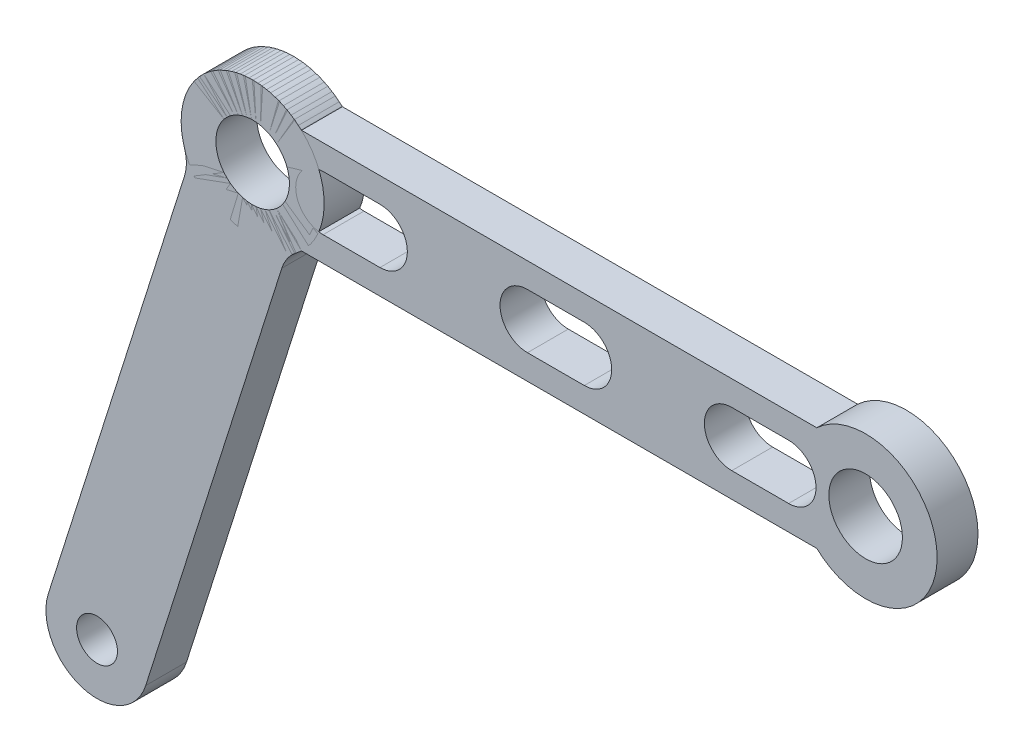
ISO-10303-21;
HEADER;
FILE_DESCRIPTION(('STEP AP214'),'2;1');
FILE_NAME('part.step','',(''),(''),'','','');
FILE_SCHEMA(('AUTOMOTIVE_DESIGN { 1 0 10303 214 1 1 1 1 }'));
ENDSEC;
DATA;
#1=APPLICATION_CONTEXT('core data for automotive mechanical design processes');
#2=APPLICATION_PROTOCOL_DEFINITION('international standard','automotive_design',2000,#1);
#3=PRODUCT_CONTEXT('',#1,'mechanical');
#4=PRODUCT('Part','Part','',(#3));
#5=PRODUCT_RELATED_PRODUCT_CATEGORY('part','',(#4));
#6=PRODUCT_DEFINITION_FORMATION('','',#4);
#7=PRODUCT_DEFINITION_CONTEXT('part definition',#1,'design');
#8=PRODUCT_DEFINITION('design','',#6,#7);
#9=PRODUCT_DEFINITION_SHAPE('','',#8);
#10=(LENGTH_UNIT() NAMED_UNIT(*) SI_UNIT(.MILLI.,.METRE.));
#11=(NAMED_UNIT(*) PLANE_ANGLE_UNIT() SI_UNIT($,.RADIAN.));
#12=(NAMED_UNIT(*) SI_UNIT($,.STERADIAN.) SOLID_ANGLE_UNIT());
#13=UNCERTAINTY_MEASURE_WITH_UNIT(LENGTH_MEASURE(1.E-05),#10,'distance_accuracy_value','');
#14=(GEOMETRIC_REPRESENTATION_CONTEXT(3) GLOBAL_UNCERTAINTY_ASSIGNED_CONTEXT((#13)) GLOBAL_UNIT_ASSIGNED_CONTEXT((#10,
#11,#12)) REPRESENTATION_CONTEXT('',''));
#15=CARTESIAN_POINT('',(0.,0.,0.));
#16=DIRECTION('',(0.,0.,1.));
#17=DIRECTION('',(1.,0.,0.));
#18=AXIS2_PLACEMENT_3D('',#15,#16,#17);
#19=CARTESIAN_POINT('',(-108.743838073078,-120.183417572632,10.));
#20=DIRECTION('',(0.,0.,1.));
#21=DIRECTION('',(1.,0.,0.));
#22=AXIS2_PLACEMENT_3D('',#19,#20,#21);
#23=PLANE('',#22);
#24=CARTESIAN_POINT('',(-108.743838073078,-120.183417572632,10.));
#25=DIRECTION('',(0.,0.,1.));
#26=DIRECTION('',(1.,0.,0.));
#27=AXIS2_PLACEMENT_3D('',#24,#25,#26);
#28=CIRCLE('',#27,5.00000000000001);
#29=CARTESIAN_POINT('',(-103.743838073078,-120.183417572632,10.));
#30=VERTEX_POINT('',#29);
#31=EDGE_CURVE('E176',#30,#30,#28,.T.);
#32=ORIENTED_EDGE('',*,*,#31,.F.);
#33=EDGE_LOOP('',(#32));
#34=FACE_BOUND('',#33,.T.);
#35=CARTESIAN_POINT('',(-108.743838073078,-120.183417572632,10.));
#36=DIRECTION('',(0.,0.,1.));
#37=DIRECTION('',(1.,0.,0.));
#38=AXIS2_PLACEMENT_3D('',#35,#36,#37);
#39=CIRCLE('',#38,12.5);
#40=CARTESIAN_POINT('',(-120.659747280354,-116.407029382318,10.));
#41=VERTEX_POINT('',#40);
#42=CARTESIAN_POINT('',(-96.8279288658011,-123.959805762945,10.));
#43=VERTEX_POINT('',#42);
#44=EDGE_CURVE('E114',#41,#43,#39,.T.);
#45=ORIENTED_EDGE('',*,*,#44,.T.);
#46=DIRECTION('',(0.302111055225087,0.953272736582131,0.));
#47=VECTOR('',#46,1.);
#48=CARTESIAN_POINT('',(-62.4395075309454,-15.4515471419775,10.));
#49=LINE('',#48,#47);
#50=CARTESIAN_POINT('',(-63.51621308031,-18.8489535850198,10.));
#51=VERTEX_POINT('',#50);
#52=EDGE_CURVE('E105',#43,#51,#49,.T.);
#53=ORIENTED_EDGE('',*,*,#52,.T.);
#54=CARTESIAN_POINT('',(-53.9834857144887,-21.8700641372707,10.));
#55=DIRECTION('',(0.,0.,1.));
#56=DIRECTION('',(1.,0.,0.));
#57=AXIS2_PLACEMENT_3D('',#54,#55,#56);
#58=CIRCLE('',#57,10.);
#59=CARTESIAN_POINT('',(-60.0459734850186,-13.9173135418995,10.));
#60=VERTEX_POINT('',#59);
#61=EDGE_CURVE('E12',#51,#60,#58,.F.);
#62=ORIENTED_EDGE('',*,*,#61,.T.);
#63=CARTESIAN_POINT('',(-70.6553270834457,0.,10.));
#64=DIRECTION('',(0.,0.,1.));
#65=DIRECTION('',(1.,0.,0.));
#66=AXIS2_PLACEMENT_3D('',#63,#64,#65);
#67=CIRCLE('',#66,17.5);
#68=CARTESIAN_POINT('',(-87.3442382144159,-5.2659515059084,10.));
#69=VERTEX_POINT('',#68);
#70=EDGE_CURVE('E113',#60,#69,#67,.T.);
#71=ORIENTED_EDGE('',*,*,#70,.T.);
#72=CARTESIAN_POINT('',(-96.8807588606846,-8.27506665214177,10.));
#73=DIRECTION('',(0.,0.,1.));
#74=DIRECTION('',(1.,0.,0.));
#75=AXIS2_PLACEMENT_3D('',#72,#73,#74);
#76=CIRCLE('',#75,10.);
#77=CARTESIAN_POINT('',(-87.3480314948633,-11.2961772043926,10.));
#78=VERTEX_POINT('',#77);
#79=EDGE_CURVE('E144',#69,#78,#76,.F.);
#80=ORIENTED_EDGE('',*,*,#79,.T.);
#81=DIRECTION('',(-0.302111055225087,-0.953272736582131,0.));
#82=VECTOR('',#81,1.);
#83=CARTESIAN_POINT('',(-86.2713259454986,-7.89877076135031,10.));
#84=LINE('',#83,#82);
#85=EDGE_CURVE('E119',#78,#41,#84,.T.);
#86=ORIENTED_EDGE('',*,*,#85,.T.);
#87=EDGE_LOOP('',(#45,#53,#62,#71,#80,#86));
#88=FACE_BOUND('',#87,.T.);
#89=CARTESIAN_POINT('',(-70.6553270834457,0.,10.));
#90=DIRECTION('',(0.,0.,1.));
#91=DIRECTION('',(1.,0.,0.));
#92=AXIS2_PLACEMENT_3D('',#89,#90,#91);
#93=CIRCLE('',#92,9.);
#94=CARTESIAN_POINT('',(-61.6553270834457,0.,10.));
#95=VERTEX_POINT('',#94);
#96=EDGE_CURVE('E167',#95,#95,#93,.T.);
#97=ORIENTED_EDGE('',*,*,#96,.F.);
#98=EDGE_LOOP('',(#97));
#99=FACE_BOUND('',#98,.T.);
#100=ADVANCED_FACE('F56',(#34,#88,#99),#23,.T.);
#101=CARTESIAN_POINT('',(-108.743838073078,-120.183417572632,0.));
#102=DIRECTION('',(0.,0.,1.));
#103=DIRECTION('',(1.,0.,0.));
#104=AXIS2_PLACEMENT_3D('',#101,#102,#103);
#105=PLANE('',#104);
#106=CARTESIAN_POINT('',(-108.743838073078,-120.183417572632,0.));
#107=DIRECTION('',(0.,0.,1.));
#108=DIRECTION('',(1.,0.,0.));
#109=AXIS2_PLACEMENT_3D('',#106,#107,#108);
#110=CIRCLE('',#109,5.00000000000001);
#111=CARTESIAN_POINT('',(-103.743838073078,-120.183417572632,0.));
#112=VERTEX_POINT('',#111);
#113=EDGE_CURVE('E173',#112,#112,#110,.T.);
#114=ORIENTED_EDGE('',*,*,#113,.T.);
#115=EDGE_LOOP('',(#114));
#116=FACE_BOUND('',#115,.T.);
#117=CARTESIAN_POINT('',(-108.743838073078,-120.183417572632,0.));
#118=DIRECTION('',(0.,0.,1.));
#119=DIRECTION('',(1.,0.,0.));
#120=AXIS2_PLACEMENT_3D('',#117,#118,#119);
#121=CIRCLE('',#120,12.5);
#122=CARTESIAN_POINT('',(-120.659747280354,-116.407029382318,0.));
#123=VERTEX_POINT('',#122);
#124=CARTESIAN_POINT('',(-96.8279288658011,-123.959805762945,0.));
#125=VERTEX_POINT('',#124);
#126=EDGE_CURVE('E127',#123,#125,#121,.T.);
#127=ORIENTED_EDGE('',*,*,#126,.F.);
#128=DIRECTION('',(-0.302111055225087,-0.953272736582131,0.));
#129=VECTOR('',#128,1.);
#130=CARTESIAN_POINT('',(-86.2713259454986,-7.89877076135031,0.));
#131=LINE('',#130,#129);
#132=CARTESIAN_POINT('',(-87.3480314948633,-11.2961772043926,0.));
#133=VERTEX_POINT('',#132);
#134=EDGE_CURVE('E123',#133,#123,#131,.T.);
#135=ORIENTED_EDGE('',*,*,#134,.F.);
#136=CARTESIAN_POINT('',(-96.8807588606846,-8.27506665214177,0.));
#137=DIRECTION('',(0.,0.,1.));
#138=DIRECTION('',(1.,0.,0.));
#139=AXIS2_PLACEMENT_3D('',#136,#137,#138);
#140=CIRCLE('',#139,10.);
#141=CARTESIAN_POINT('',(-87.3442382144159,-5.2659515059084,0.));
#142=VERTEX_POINT('',#141);
#143=EDGE_CURVE('E142',#133,#142,#140,.T.);
#144=ORIENTED_EDGE('',*,*,#143,.T.);
#145=CARTESIAN_POINT('',(-70.6553270834457,0.,0.));
#146=DIRECTION('',(0.,0.,1.));
#147=DIRECTION('',(1.,0.,0.));
#148=AXIS2_PLACEMENT_3D('',#145,#146,#147);
#149=CIRCLE('',#148,17.5);
#150=CARTESIAN_POINT('',(-60.0459734850186,-13.9173135418995,0.));
#151=VERTEX_POINT('',#150);
#152=EDGE_CURVE('E159',#151,#142,#149,.T.);
#153=ORIENTED_EDGE('',*,*,#152,.F.);
#154=CARTESIAN_POINT('',(-53.9834857144887,-21.8700641372707,0.));
#155=DIRECTION('',(0.,0.,1.));
#156=DIRECTION('',(1.,0.,0.));
#157=AXIS2_PLACEMENT_3D('',#154,#155,#156);
#158=CIRCLE('',#157,10.);
#159=CARTESIAN_POINT('',(-63.51621308031,-18.8489535850198,0.));
#160=VERTEX_POINT('',#159);
#161=EDGE_CURVE('E64',#151,#160,#158,.T.);
#162=ORIENTED_EDGE('',*,*,#161,.T.);
#163=DIRECTION('',(0.302111055225087,0.953272736582131,0.));
#164=VECTOR('',#163,1.);
#165=CARTESIAN_POINT('',(-62.4395075309454,-15.4515471419775,0.));
#166=LINE('',#165,#164);
#167=EDGE_CURVE('E163',#125,#160,#166,.T.);
#168=ORIENTED_EDGE('',*,*,#167,.F.);
#169=EDGE_LOOP('',(#127,#135,#144,#153,#162,#168));
#170=FACE_BOUND('',#169,.T.);
#171=CARTESIAN_POINT('',(-70.6553270834457,0.,0.));
#172=DIRECTION('',(0.,0.,1.));
#173=DIRECTION('',(1.,0.,0.));
#174=AXIS2_PLACEMENT_3D('',#171,#172,#173);
#175=CIRCLE('',#174,9.);
#176=CARTESIAN_POINT('',(-61.6553270834457,0.,0.));
#177=VERTEX_POINT('',#176);
#178=EDGE_CURVE('E170',#177,#177,#175,.T.);
#179=ORIENTED_EDGE('',*,*,#178,.T.);
#180=EDGE_LOOP('',(#179));
#181=FACE_BOUND('',#180,.T.);
#182=ADVANCED_FACE('F157',(#116,#170,#181),#105,.F.);
#183=CARTESIAN_POINT('',(-108.743838073078,-120.183417572632,10.));
#184=DIRECTION('',(0.,0.,-1.));
#185=DIRECTION('',(-1.,0.,0.));
#186=AXIS2_PLACEMENT_3D('',#183,#184,#185);
#187=CYLINDRICAL_SURFACE('',#186,12.5);
#188=ORIENTED_EDGE('',*,*,#126,.T.);
#189=DIRECTION('',(0.,0.,-1.));
#190=VECTOR('',#189,1.);
#191=CARTESIAN_POINT('',(-96.8279288658011,-123.959805762945,10.));
#192=LINE('',#191,#190);
#193=EDGE_CURVE('E109',#43,#125,#192,.T.);
#194=ORIENTED_EDGE('',*,*,#193,.F.);
#195=ORIENTED_EDGE('',*,*,#44,.F.);
#196=DIRECTION('',(0.,0.,-1.));
#197=VECTOR('',#196,1.);
#198=CARTESIAN_POINT('',(-120.659747280354,-116.407029382318,10.));
#199=LINE('',#198,#197);
#200=EDGE_CURVE('E129',#41,#123,#199,.T.);
#201=ORIENTED_EDGE('',*,*,#200,.T.);
#202=EDGE_LOOP('',(#188,#194,#195,#201));
#203=FACE_BOUND('',#202,.T.);
#204=ADVANCED_FACE('F125',(#203),#187,.T.);
#205=CARTESIAN_POINT('',(-62.4395075309454,-15.4515471419775,10.));
#206=DIRECTION('',(-0.953272736582131,0.302111055225087,0.));
#207=DIRECTION('',(-0.302111055225087,-0.953272736582131,0.));
#208=AXIS2_PLACEMENT_3D('',#205,#206,#207);
#209=PLANE('',#208);
#210=ORIENTED_EDGE('',*,*,#167,.T.);
#211=DIRECTION('',(0.,0.,1.));
#212=VECTOR('',#211,1.);
#213=CARTESIAN_POINT('',(-63.51621308031,-18.8489535850198,10.));
#214=LINE('',#213,#212);
#215=EDGE_CURVE('E71',#160,#51,#214,.T.);
#216=ORIENTED_EDGE('',*,*,#215,.T.);
#217=ORIENTED_EDGE('',*,*,#52,.F.);
#218=ORIENTED_EDGE('',*,*,#193,.T.);
#219=EDGE_LOOP('',(#210,#216,#217,#218));
#220=FACE_BOUND('',#219,.T.);
#221=ADVANCED_FACE('F107',(#220),#209,.F.);
#222=CARTESIAN_POINT('',(-70.6553270834457,0.,10.));
#223=DIRECTION('',(0.,0.,-1.));
#224=DIRECTION('',(-1.,0.,0.));
#225=AXIS2_PLACEMENT_3D('',#222,#223,#224);
#226=CYLINDRICAL_SURFACE('',#225,17.5);
#227=ORIENTED_EDGE('',*,*,#152,.T.);
#228=DIRECTION('',(0.,0.,-1.));
#229=VECTOR('',#228,1.);
#230=CARTESIAN_POINT('',(-87.3442382144159,-5.2659515059084,10.));
#231=LINE('',#230,#229);
#232=EDGE_CURVE('E139',#142,#69,#231,.F.);
#233=ORIENTED_EDGE('',*,*,#232,.T.);
#234=ORIENTED_EDGE('',*,*,#70,.F.);
#235=DIRECTION('',(0.,0.,-1.));
#236=VECTOR('',#235,1.);
#237=CARTESIAN_POINT('',(-60.0459734850186,-13.9173135418995,10.));
#238=LINE('',#237,#236);
#239=EDGE_CURVE('E132',#60,#151,#238,.T.);
#240=ORIENTED_EDGE('',*,*,#239,.T.);
#241=EDGE_LOOP('',(#227,#233,#234,#240));
#242=FACE_BOUND('',#241,.T.);
#243=ADVANCED_FACE('F161',(#242),#226,.T.);
#244=CARTESIAN_POINT('',(-86.2713259454986,-7.89877076135031,10.));
#245=DIRECTION('',(0.953272736582131,-0.302111055225087,0.));
#246=DIRECTION('',(0.302111055225087,0.953272736582131,0.));
#247=AXIS2_PLACEMENT_3D('',#244,#245,#246);
#248=PLANE('',#247);
#249=ORIENTED_EDGE('',*,*,#85,.F.);
#250=DIRECTION('',(0.,0.,1.));
#251=VECTOR('',#250,1.);
#252=CARTESIAN_POINT('',(-87.3480314948633,-11.2961772043926,0.));
#253=LINE('',#252,#251);
#254=EDGE_CURVE('E128',#78,#133,#253,.F.);
#255=ORIENTED_EDGE('',*,*,#254,.T.);
#256=ORIENTED_EDGE('',*,*,#134,.T.);
#257=ORIENTED_EDGE('',*,*,#200,.F.);
#258=EDGE_LOOP('',(#249,#255,#256,#257));
#259=FACE_BOUND('',#258,.T.);
#260=ADVANCED_FACE('F152',(#259),#248,.F.);
#261=CARTESIAN_POINT('',(-70.6553270834457,0.,10.));
#262=DIRECTION('',(0.,0.,-1.));
#263=DIRECTION('',(-1.,0.,0.));
#264=AXIS2_PLACEMENT_3D('',#261,#262,#263);
#265=CYLINDRICAL_SURFACE('',#264,9.);
#266=ORIENTED_EDGE('',*,*,#96,.T.);
#267=EDGE_LOOP('',(#266));
#268=FACE_BOUND('',#267,.T.);
#269=ORIENTED_EDGE('',*,*,#178,.F.);
#270=EDGE_LOOP('',(#269));
#271=FACE_BOUND('',#270,.T.);
#272=ADVANCED_FACE('F186',(#268,#271),#265,.F.);
#273=CARTESIAN_POINT('',(-108.743838073078,-120.183417572632,0.));
#274=DIRECTION('',(0.,0.,1.));
#275=DIRECTION('',(1.,0.,0.));
#276=AXIS2_PLACEMENT_3D('',#273,#274,#275);
#277=CYLINDRICAL_SURFACE('',#276,5.00000000000001);
#278=ORIENTED_EDGE('',*,*,#113,.F.);
#279=EDGE_LOOP('',(#278));
#280=FACE_BOUND('',#279,.T.);
#281=ORIENTED_EDGE('',*,*,#31,.T.);
#282=EDGE_LOOP('',(#281));
#283=FACE_BOUND('',#282,.T.);
#284=ADVANCED_FACE('F183',(#280,#283),#277,.F.);
#285=CARTESIAN_POINT('',(-96.8807588606846,-8.27506665214177,10.));
#286=DIRECTION('',(0.,0.,-1.));
#287=DIRECTION('',(-1.,0.,0.));
#288=AXIS2_PLACEMENT_3D('',#285,#286,#287);
#289=CYLINDRICAL_SURFACE('',#288,10.);
#290=ORIENTED_EDGE('',*,*,#79,.F.);
#291=ORIENTED_EDGE('',*,*,#232,.F.);
#292=ORIENTED_EDGE('',*,*,#143,.F.);
#293=ORIENTED_EDGE('',*,*,#254,.F.);
#294=EDGE_LOOP('',(#290,#291,#292,#293));
#295=FACE_BOUND('',#294,.T.);
#296=ADVANCED_FACE('F155',(#295),#289,.F.);
#297=CARTESIAN_POINT('',(-53.9834857144887,-21.8700641372707,10.));
#298=DIRECTION('',(0.,0.,-1.));
#299=DIRECTION('',(-1.,0.,0.));
#300=AXIS2_PLACEMENT_3D('',#297,#298,#299);
#301=CYLINDRICAL_SURFACE('',#300,10.);
#302=ORIENTED_EDGE('',*,*,#61,.F.);
#303=ORIENTED_EDGE('',*,*,#215,.F.);
#304=ORIENTED_EDGE('',*,*,#161,.F.);
#305=ORIENTED_EDGE('',*,*,#239,.F.);
#306=EDGE_LOOP('',(#302,#303,#304,#305));
#307=FACE_BOUND('',#306,.T.);
#308=ADVANCED_FACE('F58',(#307),#301,.F.);
#309=CLOSED_SHELL('',(#100,#182,#204,#221,#243,#260,#272,#284,#296,#308));
#310=MANIFOLD_SOLID_BREP('B2',#309);
#311=CARTESIAN_POINT('',(79.3446729165543,0.,10.));
#312=DIRECTION('',(0.,0.,1.));
#313=DIRECTION('',(1.,0.,0.));
#314=AXIS2_PLACEMENT_3D('',#311,#312,#313);
#315=PLANE('',#314);
#316=CARTESIAN_POINT('',(-70.6553270834457,0.,10.));
#317=DIRECTION('',(0.,0.,1.));
#318=DIRECTION('',(1.,0.,0.));
#319=AXIS2_PLACEMENT_3D('',#316,#317,#318);
#320=CIRCLE('',#319,9.);
#321=CARTESIAN_POINT('',(-61.6553270834457,0.,10.));
#322=VERTEX_POINT('',#321);
#323=EDGE_CURVE('E490',#322,#322,#320,.T.);
#324=ORIENTED_EDGE('',*,*,#323,.F.);
#325=EDGE_LOOP('',(#324));
#326=FACE_BOUND('',#325,.T.);
#327=CARTESIAN_POINT('',(79.3446729165543,0.,10.));
#328=DIRECTION('',(0.,0.,1.));
#329=DIRECTION('',(1.,0.,0.));
#330=AXIS2_PLACEMENT_3D('',#327,#328,#329);
#331=CIRCLE('',#330,17.5);
#332=CARTESIAN_POINT('',(67.3933803190566,-12.7834504437963,10.));
#333=VERTEX_POINT('',#332);
#334=CARTESIAN_POINT('',(67.3933803190566,12.7834504437963,10.));
#335=VERTEX_POINT('',#334);
#336=EDGE_CURVE('E496',#333,#335,#331,.T.);
#337=ORIENTED_EDGE('',*,*,#336,.T.);
#338=DIRECTION('',(-1.,0.,0.));
#339=VECTOR('',#338,1.);
#340=CARTESIAN_POINT('',(-58.704034485948,12.7834504437963,10.));
#341=LINE('',#340,#339);
#342=CARTESIAN_POINT('',(-58.704034485948,12.7834504437963,10.));
#343=VERTEX_POINT('',#342);
#344=EDGE_CURVE('E499',#335,#343,#341,.T.);
#345=ORIENTED_EDGE('',*,*,#344,.T.);
#346=CARTESIAN_POINT('',(-70.6553270834457,0.,10.));
#347=DIRECTION('',(0.,0.,1.));
#348=DIRECTION('',(1.,0.,0.));
#349=AXIS2_PLACEMENT_3D('',#346,#347,#348);
#350=CIRCLE('',#349,17.5);
#351=CARTESIAN_POINT('',(-58.7040344859481,-12.7834504437963,10.));
#352=VERTEX_POINT('',#351);
#353=EDGE_CURVE('E502',#343,#352,#350,.T.);
#354=ORIENTED_EDGE('',*,*,#353,.T.);
#355=DIRECTION('',(1.,0.,0.));
#356=VECTOR('',#355,1.);
#357=CARTESIAN_POINT('',(-58.704034485948,-12.7834504437963,10.));
#358=LINE('',#357,#356);
#359=EDGE_CURVE('E504',#352,#333,#358,.T.);
#360=ORIENTED_EDGE('',*,*,#359,.T.);
#361=EDGE_LOOP('',(#337,#345,#354,#360));
#362=FACE_BOUND('',#361,.T.);
#363=CARTESIAN_POINT('',(79.3446729165543,0.,10.));
#364=DIRECTION('',(0.,0.,1.));
#365=DIRECTION('',(1.,0.,0.));
#366=AXIS2_PLACEMENT_3D('',#363,#364,#365);
#367=CIRCLE('',#366,9.);
#368=CARTESIAN_POINT('',(88.3446729165542,0.,10.));
#369=VERTEX_POINT('',#368);
#370=EDGE_CURVE('E484',#369,#369,#367,.T.);
#371=ORIENTED_EDGE('',*,*,#370,.F.);
#372=EDGE_LOOP('',(#371));
#373=FACE_BOUND('',#372,.T.);
#374=DIRECTION('',(1.,0.,0.));
#375=VECTOR('',#374,1.);
#376=CARTESIAN_POINT('',(-53.4129788387876,-6.70241567098039,10.));
#377=LINE('',#376,#375);
#378=CARTESIAN_POINT('',(-53.4129788387876,-6.70241567098039,10.));
#379=VERTEX_POINT('',#378);
#380=CARTESIAN_POINT('',(-39.5013970371676,-6.70241567098039,10.));
#381=VERTEX_POINT('',#380);
#382=EDGE_CURVE('E455',#379,#381,#377,.T.);
#383=ORIENTED_EDGE('',*,*,#382,.F.);
#384=CARTESIAN_POINT('',(-53.4129788387876,0.,10.));
#385=DIRECTION('',(0.,0.,1.));
#386=DIRECTION('',(1.,0.,0.));
#387=AXIS2_PLACEMENT_3D('',#384,#385,#386);
#388=CIRCLE('',#387,6.70241567098039);
#389=CARTESIAN_POINT('',(-53.4129788387876,6.70241567098039,10.));
#390=VERTEX_POINT('',#389);
#391=EDGE_CURVE('E453',#390,#379,#388,.T.);
#392=ORIENTED_EDGE('',*,*,#391,.F.);
#393=DIRECTION('',(-1.,0.,0.));
#394=VECTOR('',#393,1.);
#395=CARTESIAN_POINT('',(-53.4129788387876,6.70241567098039,10.));
#396=LINE('',#395,#394);
#397=CARTESIAN_POINT('',(-39.5013970371676,6.70241567098039,10.));
#398=VERTEX_POINT('',#397);
#399=EDGE_CURVE('E461',#398,#390,#396,.T.);
#400=ORIENTED_EDGE('',*,*,#399,.F.);
#401=CARTESIAN_POINT('',(-39.5013970371676,0.,10.));
#402=DIRECTION('',(0.,0.,1.));
#403=DIRECTION('',(1.,0.,0.));
#404=AXIS2_PLACEMENT_3D('',#401,#402,#403);
#405=CIRCLE('',#404,6.70241567098039);
#406=EDGE_CURVE('E458',#381,#398,#405,.T.);
#407=ORIENTED_EDGE('',*,*,#406,.F.);
#408=EDGE_LOOP('',(#383,#392,#400,#407));
#409=FACE_BOUND('',#408,.T.);
#410=DIRECTION('',(1.,0.,0.));
#411=VECTOR('',#410,1.);
#412=CARTESIAN_POINT('',(-3.41297883878763,-6.7024156709804,10.));
#413=LINE('',#412,#411);
#414=CARTESIAN_POINT('',(-3.41297883878763,-6.7024156709804,10.));
#415=VERTEX_POINT('',#414);
#416=CARTESIAN_POINT('',(10.4986029628324,-6.7024156709804,10.));
#417=VERTEX_POINT('',#416);
#418=EDGE_CURVE('E424',#415,#417,#413,.T.);
#419=ORIENTED_EDGE('',*,*,#418,.F.);
#420=CARTESIAN_POINT('',(-3.41297883878763,0.,10.));
#421=DIRECTION('',(0.,0.,1.));
#422=DIRECTION('',(1.,0.,0.));
#423=AXIS2_PLACEMENT_3D('',#420,#421,#422);
#424=CIRCLE('',#423,6.7024156709804);
#425=CARTESIAN_POINT('',(-3.41297883878763,6.7024156709804,10.));
#426=VERTEX_POINT('',#425);
#427=EDGE_CURVE('E422',#426,#415,#424,.T.);
#428=ORIENTED_EDGE('',*,*,#427,.F.);
#429=DIRECTION('',(-1.,0.,0.));
#430=VECTOR('',#429,1.);
#431=CARTESIAN_POINT('',(-3.41297883878763,6.7024156709804,10.));
#432=LINE('',#431,#430);
#433=CARTESIAN_POINT('',(10.4986029628324,6.7024156709804,10.));
#434=VERTEX_POINT('',#433);
#435=EDGE_CURVE('E430',#434,#426,#432,.T.);
#436=ORIENTED_EDGE('',*,*,#435,.F.);
#437=CARTESIAN_POINT('',(10.4986029628324,0.,10.));
#438=DIRECTION('',(0.,0.,1.));
#439=DIRECTION('',(1.,0.,0.));
#440=AXIS2_PLACEMENT_3D('',#437,#438,#439);
#441=CIRCLE('',#440,6.7024156709804);
#442=EDGE_CURVE('E427',#417,#434,#441,.T.);
#443=ORIENTED_EDGE('',*,*,#442,.F.);
#444=EDGE_LOOP('',(#419,#428,#436,#443));
#445=FACE_BOUND('',#444,.T.);
#446=DIRECTION('',(1.,0.,0.));
#447=VECTOR('',#446,1.);
#448=CARTESIAN_POINT('',(46.5870211612124,-6.7024156709804,10.));
#449=LINE('',#448,#447);
#450=CARTESIAN_POINT('',(46.5870211612124,-6.7024156709804,10.));
#451=VERTEX_POINT('',#450);
#452=CARTESIAN_POINT('',(60.4986029628324,-6.7024156709804,10.));
#453=VERTEX_POINT('',#452);
#454=EDGE_CURVE('E394',#451,#453,#449,.T.);
#455=ORIENTED_EDGE('',*,*,#454,.F.);
#456=CARTESIAN_POINT('',(46.5870211612124,0.,10.));
#457=DIRECTION('',(0.,0.,1.));
#458=DIRECTION('',(1.,0.,0.));
#459=AXIS2_PLACEMENT_3D('',#456,#457,#458);
#460=CIRCLE('',#459,6.7024156709804);
#461=CARTESIAN_POINT('',(46.5870211612124,6.7024156709804,10.));
#462=VERTEX_POINT('',#461);
#463=EDGE_CURVE('E386',#462,#451,#460,.T.);
#464=ORIENTED_EDGE('',*,*,#463,.F.);
#465=DIRECTION('',(-1.,0.,0.));
#466=VECTOR('',#465,1.);
#467=CARTESIAN_POINT('',(46.5870211612124,6.7024156709804,10.));
#468=LINE('',#467,#466);
#469=CARTESIAN_POINT('',(60.4986029628324,6.7024156709804,10.));
#470=VERTEX_POINT('',#469);
#471=EDGE_CURVE('E408',#470,#462,#468,.T.);
#472=ORIENTED_EDGE('',*,*,#471,.F.);
#473=CARTESIAN_POINT('',(60.4986029628324,0.,10.));
#474=DIRECTION('',(0.,0.,1.));
#475=DIRECTION('',(1.,0.,0.));
#476=AXIS2_PLACEMENT_3D('',#473,#474,#475);
#477=CIRCLE('',#476,6.7024156709804);
#478=EDGE_CURVE('E406',#453,#470,#477,.T.);
#479=ORIENTED_EDGE('',*,*,#478,.F.);
#480=EDGE_LOOP('',(#455,#464,#472,#479));
#481=FACE_BOUND('',#480,.T.);
#482=ADVANCED_FACE('F273',(#326,#362,#373,#409,#445,#481),#315,.T.);
#483=CARTESIAN_POINT('',(79.3446729165543,0.,0.));
#484=DIRECTION('',(0.,0.,1.));
#485=DIRECTION('',(1.,0.,0.));
#486=AXIS2_PLACEMENT_3D('',#483,#484,#485);
#487=PLANE('',#486);
#488=CARTESIAN_POINT('',(-3.41297883878763,0.,0.));
#489=DIRECTION('',(0.,0.,1.));
#490=DIRECTION('',(1.,0.,0.));
#491=AXIS2_PLACEMENT_3D('',#488,#489,#490);
#492=CIRCLE('',#491,6.7024156709804);
#493=CARTESIAN_POINT('',(-3.41297883878762,6.7024156709804,0.));
#494=VERTEX_POINT('',#493);
#495=CARTESIAN_POINT('',(-3.41297883878763,-6.7024156709804,0.));
#496=VERTEX_POINT('',#495);
#497=EDGE_CURVE('E402',#494,#496,#492,.T.);
#498=ORIENTED_EDGE('',*,*,#497,.T.);
#499=DIRECTION('',(1.,0.,0.));
#500=VECTOR('',#499,1.);
#501=CARTESIAN_POINT('',(-3.41297883878763,-6.7024156709804,0.));
#502=LINE('',#501,#500);
#503=CARTESIAN_POINT('',(10.4986029628324,-6.7024156709804,0.));
#504=VERTEX_POINT('',#503);
#505=EDGE_CURVE('E435',#496,#504,#502,.T.);
#506=ORIENTED_EDGE('',*,*,#505,.T.);
#507=CARTESIAN_POINT('',(10.4986029628324,0.,0.));
#508=DIRECTION('',(0.,0.,1.));
#509=DIRECTION('',(1.,0.,0.));
#510=AXIS2_PLACEMENT_3D('',#507,#508,#509);
#511=CIRCLE('',#510,6.7024156709804);
#512=CARTESIAN_POINT('',(10.4986029628324,6.7024156709804,0.));
#513=VERTEX_POINT('',#512);
#514=EDGE_CURVE('E438',#504,#513,#511,.T.);
#515=ORIENTED_EDGE('',*,*,#514,.T.);
#516=DIRECTION('',(-1.,0.,0.));
#517=VECTOR('',#516,1.);
#518=CARTESIAN_POINT('',(-3.41297883878763,6.7024156709804,0.));
#519=LINE('',#518,#517);
#520=EDGE_CURVE('E425',#513,#494,#519,.T.);
#521=ORIENTED_EDGE('',*,*,#520,.T.);
#522=EDGE_LOOP('',(#498,#506,#515,#521));
#523=FACE_BOUND('',#522,.T.);
#524=CARTESIAN_POINT('',(79.3446729165543,0.,0.));
#525=DIRECTION('',(0.,0.,1.));
#526=DIRECTION('',(1.,0.,0.));
#527=AXIS2_PLACEMENT_3D('',#524,#525,#526);
#528=CIRCLE('',#527,9.);
#529=CARTESIAN_POINT('',(88.3446729165542,0.,0.));
#530=VERTEX_POINT('',#529);
#531=EDGE_CURVE('E483',#530,#530,#528,.T.);
#532=ORIENTED_EDGE('',*,*,#531,.T.);
#533=EDGE_LOOP('',(#532));
#534=FACE_BOUND('',#533,.T.);
#535=CARTESIAN_POINT('',(-70.6553270834457,0.,0.));
#536=DIRECTION('',(0.,0.,1.));
#537=DIRECTION('',(1.,0.,0.));
#538=AXIS2_PLACEMENT_3D('',#535,#536,#537);
#539=CIRCLE('',#538,9.);
#540=CARTESIAN_POINT('',(-61.6553270834457,0.,0.));
#541=VERTEX_POINT('',#540);
#542=EDGE_CURVE('E487',#541,#541,#539,.T.);
#543=ORIENTED_EDGE('',*,*,#542,.T.);
#544=EDGE_LOOP('',(#543));
#545=FACE_BOUND('',#544,.T.);
#546=CARTESIAN_POINT('',(79.3446729165543,0.,0.));
#547=DIRECTION('',(0.,0.,1.));
#548=DIRECTION('',(1.,0.,0.));
#549=AXIS2_PLACEMENT_3D('',#546,#547,#548);
#550=CIRCLE('',#549,17.5);
#551=CARTESIAN_POINT('',(67.3933803190566,-12.7834504437963,0.));
#552=VERTEX_POINT('',#551);
#553=CARTESIAN_POINT('',(67.3933803190566,12.7834504437963,0.));
#554=VERTEX_POINT('',#553);
#555=EDGE_CURVE('E493',#552,#554,#550,.T.);
#556=ORIENTED_EDGE('',*,*,#555,.F.);
#557=DIRECTION('',(1.,0.,0.));
#558=VECTOR('',#557,1.);
#559=CARTESIAN_POINT('',(-58.704034485948,-12.7834504437963,0.));
#560=LINE('',#559,#558);
#561=CARTESIAN_POINT('',(-58.7040344859481,-12.7834504437963,0.));
#562=VERTEX_POINT('',#561);
#563=EDGE_CURVE('E500',#562,#552,#560,.T.);
#564=ORIENTED_EDGE('',*,*,#563,.F.);
#565=CARTESIAN_POINT('',(-70.6553270834457,0.,0.));
#566=DIRECTION('',(0.,0.,1.));
#567=DIRECTION('',(1.,0.,0.));
#568=AXIS2_PLACEMENT_3D('',#565,#566,#567);
#569=CIRCLE('',#568,17.5);
#570=CARTESIAN_POINT('',(-58.704034485948,12.7834504437963,0.));
#571=VERTEX_POINT('',#570);
#572=EDGE_CURVE('E511',#571,#562,#569,.T.);
#573=ORIENTED_EDGE('',*,*,#572,.F.);
#574=DIRECTION('',(-1.,0.,0.));
#575=VECTOR('',#574,1.);
#576=CARTESIAN_POINT('',(-58.704034485948,12.7834504437963,0.));
#577=LINE('',#576,#575);
#578=EDGE_CURVE('E509',#554,#571,#577,.T.);
#579=ORIENTED_EDGE('',*,*,#578,.F.);
#580=EDGE_LOOP('',(#556,#564,#573,#579));
#581=FACE_BOUND('',#580,.T.);
#582=CARTESIAN_POINT('',(-53.4129788387876,0.,0.));
#583=DIRECTION('',(0.,0.,1.));
#584=DIRECTION('',(1.,0.,0.));
#585=AXIS2_PLACEMENT_3D('',#582,#583,#584);
#586=CIRCLE('',#585,6.70241567098039);
#587=CARTESIAN_POINT('',(-53.4129788387876,6.70241567098039,0.));
#588=VERTEX_POINT('',#587);
#589=CARTESIAN_POINT('',(-53.4129788387876,-6.70241567098039,0.));
#590=VERTEX_POINT('',#589);
#591=EDGE_CURVE('E452',#588,#590,#586,.T.);
#592=ORIENTED_EDGE('',*,*,#591,.T.);
#593=DIRECTION('',(1.,0.,0.));
#594=VECTOR('',#593,1.);
#595=CARTESIAN_POINT('',(-53.4129788387876,-6.70241567098039,0.));
#596=LINE('',#595,#594);
#597=CARTESIAN_POINT('',(-39.5013970371676,-6.70241567098039,0.));
#598=VERTEX_POINT('',#597);
#599=EDGE_CURVE('E466',#590,#598,#596,.T.);
#600=ORIENTED_EDGE('',*,*,#599,.T.);
#601=CARTESIAN_POINT('',(-39.5013970371676,0.,0.));
#602=DIRECTION('',(0.,0.,1.));
#603=DIRECTION('',(1.,0.,0.));
#604=AXIS2_PLACEMENT_3D('',#601,#602,#603);
#605=CIRCLE('',#604,6.70241567098039);
#606=CARTESIAN_POINT('',(-39.5013970371676,6.70241567098039,0.));
#607=VERTEX_POINT('',#606);
#608=EDGE_CURVE('E469',#598,#607,#605,.T.);
#609=ORIENTED_EDGE('',*,*,#608,.T.);
#610=DIRECTION('',(-1.,0.,0.));
#611=VECTOR('',#610,1.);
#612=CARTESIAN_POINT('',(-53.4129788387876,6.70241567098039,0.));
#613=LINE('',#612,#611);
#614=EDGE_CURVE('E456',#607,#588,#613,.T.);
#615=ORIENTED_EDGE('',*,*,#614,.T.);
#616=EDGE_LOOP('',(#592,#600,#609,#615));
#617=FACE_BOUND('',#616,.T.);
#618=CARTESIAN_POINT('',(46.5870211612124,0.,0.));
#619=DIRECTION('',(0.,0.,1.));
#620=DIRECTION('',(1.,0.,0.));
#621=AXIS2_PLACEMENT_3D('',#618,#619,#620);
#622=CIRCLE('',#621,6.7024156709804);
#623=CARTESIAN_POINT('',(46.5870211612124,6.7024156709804,0.));
#624=VERTEX_POINT('',#623);
#625=CARTESIAN_POINT('',(46.5870211612124,-6.7024156709804,0.));
#626=VERTEX_POINT('',#625);
#627=EDGE_CURVE('E296',#624,#626,#622,.T.);
#628=ORIENTED_EDGE('',*,*,#627,.T.);
#629=DIRECTION('',(1.,0.,0.));
#630=VECTOR('',#629,1.);
#631=CARTESIAN_POINT('',(46.5870211612124,-6.7024156709804,0.));
#632=LINE('',#631,#630);
#633=CARTESIAN_POINT('',(60.4986029628324,-6.7024156709804,0.));
#634=VERTEX_POINT('',#633);
#635=EDGE_CURVE('E401',#626,#634,#632,.T.);
#636=ORIENTED_EDGE('',*,*,#635,.T.);
#637=CARTESIAN_POINT('',(60.4986029628324,0.,0.));
#638=DIRECTION('',(0.,0.,1.));
#639=DIRECTION('',(1.,0.,0.));
#640=AXIS2_PLACEMENT_3D('',#637,#638,#639);
#641=CIRCLE('',#640,6.7024156709804);
#642=CARTESIAN_POINT('',(60.4986029628324,6.7024156709804,0.));
#643=VERTEX_POINT('',#642);
#644=EDGE_CURVE('E414',#634,#643,#641,.T.);
#645=ORIENTED_EDGE('',*,*,#644,.T.);
#646=DIRECTION('',(-1.,0.,0.));
#647=VECTOR('',#646,1.);
#648=CARTESIAN_POINT('',(46.5870211612124,6.7024156709804,0.));
#649=LINE('',#648,#647);
#650=EDGE_CURVE('E395',#643,#624,#649,.T.);
#651=ORIENTED_EDGE('',*,*,#650,.T.);
#652=EDGE_LOOP('',(#628,#636,#645,#651));
#653=FACE_BOUND('',#652,.T.);
#654=ADVANCED_FACE('F529',(#523,#534,#545,#581,#617,#653),#487,.F.);
#655=CARTESIAN_POINT('',(79.3446729165543,0.,10.));
#656=DIRECTION('',(0.,0.,-1.));
#657=DIRECTION('',(-1.,0.,0.));
#658=AXIS2_PLACEMENT_3D('',#655,#656,#657);
#659=CYLINDRICAL_SURFACE('',#658,17.5);
#660=ORIENTED_EDGE('',*,*,#555,.T.);
#661=DIRECTION('',(0.,0.,-1.));
#662=VECTOR('',#661,1.);
#663=CARTESIAN_POINT('',(67.3933803190566,12.7834504437963,10.));
#664=LINE('',#663,#662);
#665=EDGE_CURVE('E54',#335,#554,#664,.T.);
#666=ORIENTED_EDGE('',*,*,#665,.F.);
#667=ORIENTED_EDGE('',*,*,#336,.F.);
#668=DIRECTION('',(0.,0.,-1.));
#669=VECTOR('',#668,1.);
#670=CARTESIAN_POINT('',(67.3933803190566,-12.7834504437963,10.));
#671=LINE('',#670,#669);
#672=EDGE_CURVE('E506',#333,#552,#671,.T.);
#673=ORIENTED_EDGE('',*,*,#672,.T.);
#674=EDGE_LOOP('',(#660,#666,#667,#673));
#675=FACE_BOUND('',#674,.T.);
#676=ADVANCED_FACE('F275',(#675),#659,.T.);
#677=CARTESIAN_POINT('',(-58.704034485948,12.7834504437963,10.));
#678=DIRECTION('',(0.,-1.,0.));
#679=DIRECTION('',(0.,0.,-1.));
#680=AXIS2_PLACEMENT_3D('',#677,#678,#679);
#681=PLANE('',#680);
#682=ORIENTED_EDGE('',*,*,#578,.T.);
#683=DIRECTION('',(0.,0.,-1.));
#684=VECTOR('',#683,1.);
#685=CARTESIAN_POINT('',(-58.704034485948,12.7834504437963,10.));
#686=LINE('',#685,#684);
#687=EDGE_CURVE('E281',#343,#571,#686,.T.);
#688=ORIENTED_EDGE('',*,*,#687,.F.);
#689=ORIENTED_EDGE('',*,*,#344,.F.);
#690=ORIENTED_EDGE('',*,*,#665,.T.);
#691=EDGE_LOOP('',(#682,#688,#689,#690));
#692=FACE_BOUND('',#691,.T.);
#693=ADVANCED_FACE('F540',(#692),#681,.F.);
#694=CARTESIAN_POINT('',(-70.6553270834457,0.,10.));
#695=DIRECTION('',(0.,0.,-1.));
#696=DIRECTION('',(-1.,0.,0.));
#697=AXIS2_PLACEMENT_3D('',#694,#695,#696);
#698=CYLINDRICAL_SURFACE('',#697,17.5);
#699=ORIENTED_EDGE('',*,*,#572,.T.);
#700=DIRECTION('',(0.,0.,-1.));
#701=VECTOR('',#700,1.);
#702=CARTESIAN_POINT('',(-58.7040344859481,-12.7834504437963,10.));
#703=LINE('',#702,#701);
#704=EDGE_CURVE('E516',#352,#562,#703,.T.);
#705=ORIENTED_EDGE('',*,*,#704,.F.);
#706=ORIENTED_EDGE('',*,*,#353,.F.);
#707=ORIENTED_EDGE('',*,*,#687,.T.);
#708=EDGE_LOOP('',(#699,#705,#706,#707));
#709=FACE_BOUND('',#708,.T.);
#710=ADVANCED_FACE('F523',(#709),#698,.T.);
#711=CARTESIAN_POINT('',(-58.704034485948,-12.7834504437963,10.));
#712=DIRECTION('',(0.,1.,0.));
#713=DIRECTION('',(0.,0.,1.));
#714=AXIS2_PLACEMENT_3D('',#711,#712,#713);
#715=PLANE('',#714);
#716=ORIENTED_EDGE('',*,*,#563,.T.);
#717=ORIENTED_EDGE('',*,*,#672,.F.);
#718=ORIENTED_EDGE('',*,*,#359,.F.);
#719=ORIENTED_EDGE('',*,*,#704,.T.);
#720=EDGE_LOOP('',(#716,#717,#718,#719));
#721=FACE_BOUND('',#720,.T.);
#722=ADVANCED_FACE('F533',(#721),#715,.F.);
#723=CARTESIAN_POINT('',(-70.6553270834457,0.,10.));
#724=DIRECTION('',(0.,0.,-1.));
#725=DIRECTION('',(-1.,0.,0.));
#726=AXIS2_PLACEMENT_3D('',#723,#724,#725);
#727=CYLINDRICAL_SURFACE('',#726,9.);
#728=ORIENTED_EDGE('',*,*,#323,.T.);
#729=EDGE_LOOP('',(#728));
#730=FACE_BOUND('',#729,.T.);
#731=ORIENTED_EDGE('',*,*,#542,.F.);
#732=EDGE_LOOP('',(#731));
#733=FACE_BOUND('',#732,.T.);
#734=ADVANCED_FACE('F557',(#730,#733),#727,.F.);
#735=CARTESIAN_POINT('',(79.3446729165543,0.,10.));
#736=DIRECTION('',(0.,0.,-1.));
#737=DIRECTION('',(-1.,0.,0.));
#738=AXIS2_PLACEMENT_3D('',#735,#736,#737);
#739=CYLINDRICAL_SURFACE('',#738,9.);
#740=ORIENTED_EDGE('',*,*,#370,.T.);
#741=EDGE_LOOP('',(#740));
#742=FACE_BOUND('',#741,.T.);
#743=ORIENTED_EDGE('',*,*,#531,.F.);
#744=EDGE_LOOP('',(#743));
#745=FACE_BOUND('',#744,.T.);
#746=ADVANCED_FACE('F564',(#742,#745),#739,.F.);
#747=CARTESIAN_POINT('',(-53.4129788387876,0.,10.));
#748=DIRECTION('',(0.,0.,-1.));
#749=DIRECTION('',(-1.,0.,0.));
#750=AXIS2_PLACEMENT_3D('',#747,#748,#749);
#751=CYLINDRICAL_SURFACE('',#750,6.70241567098039);
#752=ORIENTED_EDGE('',*,*,#591,.F.);
#753=DIRECTION('',(0.,0.,-1.));
#754=VECTOR('',#753,1.);
#755=CARTESIAN_POINT('',(-53.4129788387876,6.70241567098039,10.));
#756=LINE('',#755,#754);
#757=EDGE_CURVE('E463',#390,#588,#756,.T.);
#758=ORIENTED_EDGE('',*,*,#757,.F.);
#759=ORIENTED_EDGE('',*,*,#391,.T.);
#760=DIRECTION('',(0.,0.,-1.));
#761=VECTOR('',#760,1.);
#762=CARTESIAN_POINT('',(-53.4129788387876,-6.70241567098039,10.));
#763=LINE('',#762,#761);
#764=EDGE_CURVE('E480',#379,#590,#763,.T.);
#765=ORIENTED_EDGE('',*,*,#764,.T.);
#766=EDGE_LOOP('',(#752,#758,#759,#765));
#767=FACE_BOUND('',#766,.T.);
#768=ADVANCED_FACE('F569',(#767),#751,.F.);
#769=CARTESIAN_POINT('',(-53.4129788387876,-6.70241567098039,10.));
#770=DIRECTION('',(0.,1.,0.));
#771=DIRECTION('',(0.,0.,1.));
#772=AXIS2_PLACEMENT_3D('',#769,#770,#771);
#773=PLANE('',#772);
#774=ORIENTED_EDGE('',*,*,#599,.F.);
#775=ORIENTED_EDGE('',*,*,#764,.F.);
#776=ORIENTED_EDGE('',*,*,#382,.T.);
#777=DIRECTION('',(0.,0.,-1.));
#778=VECTOR('',#777,1.);
#779=CARTESIAN_POINT('',(-39.5013970371676,-6.70241567098039,10.));
#780=LINE('',#779,#778);
#781=EDGE_CURVE('E478',#381,#598,#780,.T.);
#782=ORIENTED_EDGE('',*,*,#781,.T.);
#783=EDGE_LOOP('',(#774,#775,#776,#782));
#784=FACE_BOUND('',#783,.T.);
#785=ADVANCED_FACE('F577',(#784),#773,.T.);
#786=CARTESIAN_POINT('',(-39.5013970371676,0.,10.));
#787=DIRECTION('',(0.,0.,-1.));
#788=DIRECTION('',(-1.,0.,0.));
#789=AXIS2_PLACEMENT_3D('',#786,#787,#788);
#790=CYLINDRICAL_SURFACE('',#789,6.70241567098039);
#791=ORIENTED_EDGE('',*,*,#608,.F.);
#792=ORIENTED_EDGE('',*,*,#781,.F.);
#793=ORIENTED_EDGE('',*,*,#406,.T.);
#794=DIRECTION('',(0.,0.,-1.));
#795=VECTOR('',#794,1.);
#796=CARTESIAN_POINT('',(-39.5013970371676,6.70241567098039,10.));
#797=LINE('',#796,#795);
#798=EDGE_CURVE('E476',#398,#607,#797,.T.);
#799=ORIENTED_EDGE('',*,*,#798,.T.);
#800=EDGE_LOOP('',(#791,#792,#793,#799));
#801=FACE_BOUND('',#800,.T.);
#802=ADVANCED_FACE('F584',(#801),#790,.F.);
#803=CARTESIAN_POINT('',(-53.4129788387876,6.70241567098039,10.));
#804=DIRECTION('',(0.,-1.,0.));
#805=DIRECTION('',(0.,0.,-1.));
#806=AXIS2_PLACEMENT_3D('',#803,#804,#805);
#807=PLANE('',#806);
#808=ORIENTED_EDGE('',*,*,#614,.F.);
#809=ORIENTED_EDGE('',*,*,#798,.F.);
#810=ORIENTED_EDGE('',*,*,#399,.T.);
#811=ORIENTED_EDGE('',*,*,#757,.T.);
#812=EDGE_LOOP('',(#808,#809,#810,#811));
#813=FACE_BOUND('',#812,.T.);
#814=ADVANCED_FACE('F588',(#813),#807,.T.);
#815=CARTESIAN_POINT('',(-3.41297883878763,0.,10.));
#816=DIRECTION('',(0.,0.,-1.));
#817=DIRECTION('',(-1.,0.,0.));
#818=AXIS2_PLACEMENT_3D('',#815,#816,#817);
#819=CYLINDRICAL_SURFACE('',#818,6.7024156709804);
#820=ORIENTED_EDGE('',*,*,#497,.F.);
#821=DIRECTION('',(0.,0.,-1.));
#822=VECTOR('',#821,1.);
#823=CARTESIAN_POINT('',(-3.41297883878763,6.7024156709804,10.));
#824=LINE('',#823,#822);
#825=EDGE_CURVE('E432',#426,#494,#824,.T.);
#826=ORIENTED_EDGE('',*,*,#825,.F.);
#827=ORIENTED_EDGE('',*,*,#427,.T.);
#828=DIRECTION('',(0.,0.,-1.));
#829=VECTOR('',#828,1.);
#830=CARTESIAN_POINT('',(-3.41297883878763,-6.7024156709804,10.));
#831=LINE('',#830,#829);
#832=EDGE_CURVE('E449',#415,#496,#831,.T.);
#833=ORIENTED_EDGE('',*,*,#832,.T.);
#834=EDGE_LOOP('',(#820,#826,#827,#833));
#835=FACE_BOUND('',#834,.T.);
#836=ADVANCED_FACE('F592',(#835),#819,.F.);
#837=CARTESIAN_POINT('',(-3.41297883878763,-6.7024156709804,10.));
#838=DIRECTION('',(0.,1.,0.));
#839=DIRECTION('',(0.,0.,1.));
#840=AXIS2_PLACEMENT_3D('',#837,#838,#839);
#841=PLANE('',#840);
#842=ORIENTED_EDGE('',*,*,#505,.F.);
#843=ORIENTED_EDGE('',*,*,#832,.F.);
#844=ORIENTED_EDGE('',*,*,#418,.T.);
#845=DIRECTION('',(0.,0.,-1.));
#846=VECTOR('',#845,1.);
#847=CARTESIAN_POINT('',(10.4986029628324,-6.7024156709804,10.));
#848=LINE('',#847,#846);
#849=EDGE_CURVE('E447',#417,#504,#848,.T.);
#850=ORIENTED_EDGE('',*,*,#849,.T.);
#851=EDGE_LOOP('',(#842,#843,#844,#850));
#852=FACE_BOUND('',#851,.T.);
#853=ADVANCED_FACE('F596',(#852),#841,.T.);
#854=CARTESIAN_POINT('',(10.4986029628324,0.,10.));
#855=DIRECTION('',(0.,0.,-1.));
#856=DIRECTION('',(-1.,0.,0.));
#857=AXIS2_PLACEMENT_3D('',#854,#855,#856);
#858=CYLINDRICAL_SURFACE('',#857,6.7024156709804);
#859=ORIENTED_EDGE('',*,*,#514,.F.);
#860=ORIENTED_EDGE('',*,*,#849,.F.);
#861=ORIENTED_EDGE('',*,*,#442,.T.);
#862=DIRECTION('',(0.,0.,-1.));
#863=VECTOR('',#862,1.);
#864=CARTESIAN_POINT('',(10.4986029628324,6.7024156709804,10.));
#865=LINE('',#864,#863);
#866=EDGE_CURVE('E445',#434,#513,#865,.T.);
#867=ORIENTED_EDGE('',*,*,#866,.T.);
#868=EDGE_LOOP('',(#859,#860,#861,#867));
#869=FACE_BOUND('',#868,.T.);
#870=ADVANCED_FACE('F600',(#869),#858,.F.);
#871=CARTESIAN_POINT('',(-3.41297883878763,6.7024156709804,10.));
#872=DIRECTION('',(0.,-1.,0.));
#873=DIRECTION('',(0.,0.,-1.));
#874=AXIS2_PLACEMENT_3D('',#871,#872,#873);
#875=PLANE('',#874);
#876=ORIENTED_EDGE('',*,*,#520,.F.);
#877=ORIENTED_EDGE('',*,*,#866,.F.);
#878=ORIENTED_EDGE('',*,*,#435,.T.);
#879=ORIENTED_EDGE('',*,*,#825,.T.);
#880=EDGE_LOOP('',(#876,#877,#878,#879));
#881=FACE_BOUND('',#880,.T.);
#882=ADVANCED_FACE('F604',(#881),#875,.T.);
#883=CARTESIAN_POINT('',(46.5870211612124,0.,10.));
#884=DIRECTION('',(0.,0.,-1.));
#885=DIRECTION('',(-1.,0.,0.));
#886=AXIS2_PLACEMENT_3D('',#883,#884,#885);
#887=CYLINDRICAL_SURFACE('',#886,6.7024156709804);
#888=ORIENTED_EDGE('',*,*,#627,.F.);
#889=DIRECTION('',(0.,0.,-1.));
#890=VECTOR('',#889,1.);
#891=CARTESIAN_POINT('',(46.5870211612124,6.7024156709804,10.));
#892=LINE('',#891,#890);
#893=EDGE_CURVE('E390',#462,#624,#892,.T.);
#894=ORIENTED_EDGE('',*,*,#893,.F.);
#895=ORIENTED_EDGE('',*,*,#463,.T.);
#896=DIRECTION('',(0.,0.,-1.));
#897=VECTOR('',#896,1.);
#898=CARTESIAN_POINT('',(46.5870211612124,-6.7024156709804,10.));
#899=LINE('',#898,#897);
#900=EDGE_CURVE('E389',#451,#626,#899,.T.);
#901=ORIENTED_EDGE('',*,*,#900,.T.);
#902=EDGE_LOOP('',(#888,#894,#895,#901));
#903=FACE_BOUND('',#902,.T.);
#904=ADVANCED_FACE('F388',(#903),#887,.F.);
#905=CARTESIAN_POINT('',(46.5870211612124,-6.7024156709804,10.));
#906=DIRECTION('',(0.,1.,0.));
#907=DIRECTION('',(-1.,0.,0.));
#908=AXIS2_PLACEMENT_3D('',#905,#906,#907);
#909=PLANE('',#908);
#910=ORIENTED_EDGE('',*,*,#635,.F.);
#911=ORIENTED_EDGE('',*,*,#900,.F.);
#912=ORIENTED_EDGE('',*,*,#454,.T.);
#913=DIRECTION('',(0.,0.,-1.));
#914=VECTOR('',#913,1.);
#915=CARTESIAN_POINT('',(60.4986029628324,-6.7024156709804,10.));
#916=LINE('',#915,#914);
#917=EDGE_CURVE('E403',#453,#634,#916,.T.);
#918=ORIENTED_EDGE('',*,*,#917,.T.);
#919=EDGE_LOOP('',(#910,#911,#912,#918));
#920=FACE_BOUND('',#919,.T.);
#921=ADVANCED_FACE('F398',(#920),#909,.T.);
#922=CARTESIAN_POINT('',(60.4986029628324,0.,10.));
#923=DIRECTION('',(0.,0.,-1.));
#924=DIRECTION('',(-1.,0.,0.));
#925=AXIS2_PLACEMENT_3D('',#922,#923,#924);
#926=CYLINDRICAL_SURFACE('',#925,6.7024156709804);
#927=ORIENTED_EDGE('',*,*,#644,.F.);
#928=ORIENTED_EDGE('',*,*,#917,.F.);
#929=ORIENTED_EDGE('',*,*,#478,.T.);
#930=DIRECTION('',(0.,0.,-1.));
#931=VECTOR('',#930,1.);
#932=CARTESIAN_POINT('',(60.4986029628324,6.7024156709804,10.));
#933=LINE('',#932,#931);
#934=EDGE_CURVE('E288',#470,#643,#933,.T.);
#935=ORIENTED_EDGE('',*,*,#934,.T.);
#936=EDGE_LOOP('',(#927,#928,#929,#935));
#937=FACE_BOUND('',#936,.T.);
#938=ADVANCED_FACE('F613',(#937),#926,.F.);
#939=CARTESIAN_POINT('',(46.5870211612124,6.7024156709804,10.));
#940=DIRECTION('',(0.,-1.,0.));
#941=DIRECTION('',(1.,0.,0.));
#942=AXIS2_PLACEMENT_3D('',#939,#940,#941);
#943=PLANE('',#942);
#944=ORIENTED_EDGE('',*,*,#650,.F.);
#945=ORIENTED_EDGE('',*,*,#934,.F.);
#946=ORIENTED_EDGE('',*,*,#471,.T.);
#947=ORIENTED_EDGE('',*,*,#893,.T.);
#948=EDGE_LOOP('',(#944,#945,#946,#947));
#949=FACE_BOUND('',#948,.T.);
#950=ADVANCED_FACE('F616',(#949),#943,.T.);
#951=CLOSED_SHELL('',(#482,#654,#676,#693,#710,#722,#734,#746,#768,#785,#802,#814,#836,#853,
#870,#882,#904,#921,#938,#950));
#952=MANIFOLD_SOLID_BREP('B6_NOT_SHOWN',#951);
#953=ADVANCED_BREP_SHAPE_REPRESENTATION('',(#18,#310,#952),#14);
#954=SHAPE_DEFINITION_REPRESENTATION(#9,#953);
ENDSEC;
END-ISO-10303-21;
